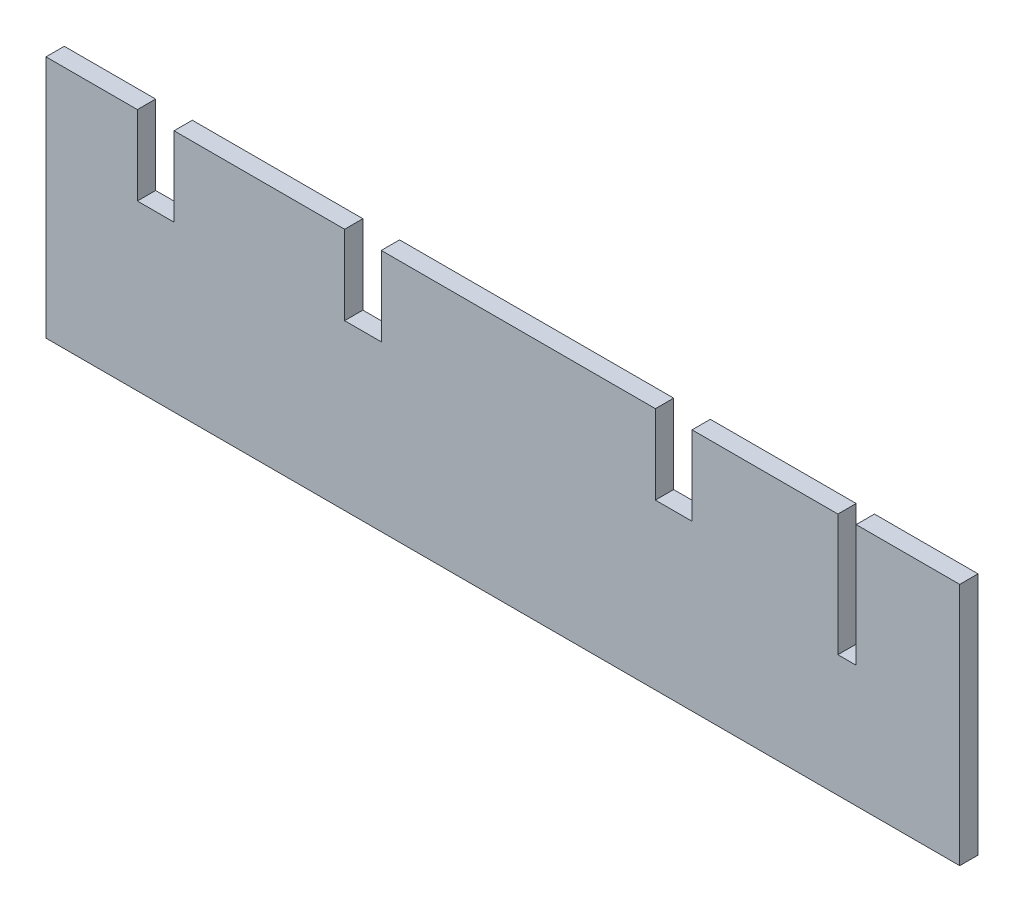
ISO-10303-21;
HEADER;
FILE_DESCRIPTION(('STEP AP214'),'2;1');
FILE_NAME('part.step','',(''),(''),'','','');
FILE_SCHEMA(('AUTOMOTIVE_DESIGN { 1 0 10303 214 1 1 1 1 }'));
ENDSEC;
DATA;
#1=APPLICATION_CONTEXT('core data for automotive mechanical design processes');
#2=APPLICATION_PROTOCOL_DEFINITION('international standard','automotive_design',2000,#1);
#3=PRODUCT_CONTEXT('',#1,'mechanical');
#4=PRODUCT('Part','Part','',(#3));
#5=PRODUCT_RELATED_PRODUCT_CATEGORY('part','',(#4));
#6=PRODUCT_DEFINITION_FORMATION('','',#4);
#7=PRODUCT_DEFINITION_CONTEXT('part definition',#1,'design');
#8=PRODUCT_DEFINITION('design','',#6,#7);
#9=PRODUCT_DEFINITION_SHAPE('','',#8);
#10=(LENGTH_UNIT() NAMED_UNIT(*) SI_UNIT(.MILLI.,.METRE.));
#11=(NAMED_UNIT(*) PLANE_ANGLE_UNIT() SI_UNIT($,.RADIAN.));
#12=(NAMED_UNIT(*) SI_UNIT($,.STERADIAN.) SOLID_ANGLE_UNIT());
#13=UNCERTAINTY_MEASURE_WITH_UNIT(LENGTH_MEASURE(1.E-05),#10,'distance_accuracy_value','');
#14=(GEOMETRIC_REPRESENTATION_CONTEXT(3) GLOBAL_UNCERTAINTY_ASSIGNED_CONTEXT((#13)) GLOBAL_UNIT_ASSIGNED_CONTEXT((#10,
#11,#12)) REPRESENTATION_CONTEXT('',''));
#15=CARTESIAN_POINT('',(0.,0.,0.));
#16=DIRECTION('',(0.,0.,1.));
#17=DIRECTION('',(1.,0.,0.));
#18=AXIS2_PLACEMENT_3D('',#15,#16,#17);
#19=CARTESIAN_POINT('',(-167.88,40.,6.));
#20=DIRECTION('',(0.,-1.,0.));
#21=DIRECTION('',(0.,0.,-1.));
#22=AXIS2_PLACEMENT_3D('',#19,#20,#21);
#23=PLANE('',#22);
#24=DIRECTION('',(-1.,0.,0.));
#25=VECTOR('',#24,1.);
#26=CARTESIAN_POINT('',(-167.88,40.,0.));
#27=LINE('',#26,#25);
#28=CARTESIAN_POINT('',(-80.,40.,0.));
#29=VERTEX_POINT('',#28);
#30=CARTESIAN_POINT('',(-114.,40.,0.));
#31=VERTEX_POINT('',#30);
#32=EDGE_CURVE('E203',#29,#31,#27,.T.);
#33=ORIENTED_EDGE('',*,*,#32,.T.);
#34=DIRECTION('',(0.,0.,-1.));
#35=VECTOR('',#34,1.);
#36=CARTESIAN_POINT('',(-114.,40.,10.));
#37=LINE('',#36,#35);
#38=CARTESIAN_POINT('',(-114.,40.,6.));
#39=VERTEX_POINT('',#38);
#40=EDGE_CURVE('E277',#39,#31,#37,.T.);
#41=ORIENTED_EDGE('',*,*,#40,.F.);
#42=DIRECTION('',(-1.,0.,0.));
#43=VECTOR('',#42,1.);
#44=CARTESIAN_POINT('',(-167.88,40.,6.));
#45=LINE('',#44,#43);
#46=CARTESIAN_POINT('',(-80.,40.,6.));
#47=VERTEX_POINT('',#46);
#48=EDGE_CURVE('E311',#47,#39,#45,.T.);
#49=ORIENTED_EDGE('',*,*,#48,.F.);
#50=DIRECTION('',(0.,0.,-1.));
#51=VECTOR('',#50,1.);
#52=CARTESIAN_POINT('',(-80.,40.,6.));
#53=LINE('',#52,#51);
#54=EDGE_CURVE('E259',#47,#29,#53,.T.);
#55=ORIENTED_EDGE('',*,*,#54,.T.);
#56=EDGE_LOOP('',(#33,#41,#49,#55));
#57=FACE_BOUND('',#56,.T.);
#58=ADVANCED_FACE('F37',(#57),#23,.F.);
#59=CARTESIAN_POINT('',(-380.,40.,6.));
#60=DIRECTION('',(1.,0.,0.));
#61=DIRECTION('',(0.,0.,-1.));
#62=AXIS2_PLACEMENT_3D('',#59,#60,#61);
#63=PLANE('',#62);
#64=DIRECTION('',(0.,-1.,0.));
#65=VECTOR('',#64,1.);
#66=CARTESIAN_POINT('',(-380.,40.,0.));
#67=LINE('',#66,#65);
#68=CARTESIAN_POINT('',(-380.,40.,0.));
#69=VERTEX_POINT('',#68);
#70=CARTESIAN_POINT('',(-380.,-40.,0.));
#71=VERTEX_POINT('',#70);
#72=EDGE_CURVE('E194',#69,#71,#67,.T.);
#73=ORIENTED_EDGE('',*,*,#72,.T.);
#74=DIRECTION('',(0.,0.,-1.));
#75=VECTOR('',#74,1.);
#76=CARTESIAN_POINT('',(-380.,-40.,6.));
#77=LINE('',#76,#75);
#78=CARTESIAN_POINT('',(-380.,-40.,6.));
#79=VERTEX_POINT('',#78);
#80=EDGE_CURVE('E11',#79,#71,#77,.T.);
#81=ORIENTED_EDGE('',*,*,#80,.F.);
#82=DIRECTION('',(0.,-1.,0.));
#83=VECTOR('',#82,1.);
#84=CARTESIAN_POINT('',(-380.,40.,6.));
#85=LINE('',#84,#83);
#86=CARTESIAN_POINT('',(-380.,40.,6.));
#87=VERTEX_POINT('',#86);
#88=EDGE_CURVE('E228',#87,#79,#85,.T.);
#89=ORIENTED_EDGE('',*,*,#88,.F.);
#90=DIRECTION('',(0.,0.,-1.));
#91=VECTOR('',#90,1.);
#92=CARTESIAN_POINT('',(-380.,40.,6.));
#93=LINE('',#92,#91);
#94=EDGE_CURVE('E190',#87,#69,#93,.T.);
#95=ORIENTED_EDGE('',*,*,#94,.T.);
#96=EDGE_LOOP('',(#73,#81,#89,#95));
#97=FACE_BOUND('',#96,.T.);
#98=ADVANCED_FACE('F39',(#97),#63,.F.);
#99=CARTESIAN_POINT('',(-380.,-40.,6.));
#100=DIRECTION('',(0.,1.,0.));
#101=DIRECTION('',(-1.,0.,0.));
#102=AXIS2_PLACEMENT_3D('',#99,#100,#101);
#103=PLANE('',#102);
#104=DIRECTION('',(1.,0.,0.));
#105=VECTOR('',#104,1.);
#106=CARTESIAN_POINT('',(-380.,-40.,0.));
#107=LINE('',#106,#105);
#108=CARTESIAN_POINT('',(-80.,-40.,0.));
#109=VERTEX_POINT('',#108);
#110=EDGE_CURVE('E197',#71,#109,#107,.T.);
#111=ORIENTED_EDGE('',*,*,#110,.T.);
#112=DIRECTION('',(0.,0.,-1.));
#113=VECTOR('',#112,1.);
#114=CARTESIAN_POINT('',(-80.,-40.,6.));
#115=LINE('',#114,#113);
#116=CARTESIAN_POINT('',(-80.,-40.,6.));
#117=VERTEX_POINT('',#116);
#118=EDGE_CURVE('E45',#117,#109,#115,.T.);
#119=ORIENTED_EDGE('',*,*,#118,.F.);
#120=DIRECTION('',(1.,0.,0.));
#121=VECTOR('',#120,1.);
#122=CARTESIAN_POINT('',(-380.,-40.,6.));
#123=LINE('',#122,#121);
#124=EDGE_CURVE('E126',#79,#117,#123,.T.);
#125=ORIENTED_EDGE('',*,*,#124,.F.);
#126=ORIENTED_EDGE('',*,*,#80,.T.);
#127=EDGE_LOOP('',(#111,#119,#125,#126));
#128=FACE_BOUND('',#127,.T.);
#129=ADVANCED_FACE('F342',(#128),#103,.F.);
#130=CARTESIAN_POINT('',(-80.,40.,6.));
#131=DIRECTION('',(-1.,0.,0.));
#132=DIRECTION('',(0.,0.,1.));
#133=AXIS2_PLACEMENT_3D('',#130,#131,#132);
#134=PLANE('',#133);
#135=DIRECTION('',(0.,1.,0.));
#136=VECTOR('',#135,1.);
#137=CARTESIAN_POINT('',(-80.,40.,0.));
#138=LINE('',#137,#136);
#139=EDGE_CURVE('E200',#109,#29,#138,.T.);
#140=ORIENTED_EDGE('',*,*,#139,.T.);
#141=ORIENTED_EDGE('',*,*,#54,.F.);
#142=DIRECTION('',(0.,1.,0.));
#143=VECTOR('',#142,1.);
#144=CARTESIAN_POINT('',(-80.,40.,6.));
#145=LINE('',#144,#143);
#146=EDGE_CURVE('E267',#117,#47,#145,.T.);
#147=ORIENTED_EDGE('',*,*,#146,.F.);
#148=ORIENTED_EDGE('',*,*,#118,.T.);
#149=EDGE_LOOP('',(#140,#141,#147,#148));
#150=FACE_BOUND('',#149,.T.);
#151=ADVANCED_FACE('F265',(#150),#134,.F.);
#152=CARTESIAN_POINT('',(-120.,40.,6.));
#153=VERTEX_POINT('',#152);
#154=CARTESIAN_POINT('',(-167.88,40.,6.));
#155=VERTEX_POINT('',#154);
#156=EDGE_CURVE('E310',#153,#155,#45,.T.);
#157=ORIENTED_EDGE('',*,*,#156,.F.);
#158=DIRECTION('',(0.,0.,-1.));
#159=VECTOR('',#158,1.);
#160=CARTESIAN_POINT('',(-120.,40.,10.));
#161=LINE('',#160,#159);
#162=CARTESIAN_POINT('',(-120.,40.,0.));
#163=VERTEX_POINT('',#162);
#164=EDGE_CURVE('E296',#153,#163,#161,.T.);
#165=ORIENTED_EDGE('',*,*,#164,.T.);
#166=CARTESIAN_POINT('',(-167.88,40.,0.));
#167=VERTEX_POINT('',#166);
#168=EDGE_CURVE('E202',#163,#167,#27,.T.);
#169=ORIENTED_EDGE('',*,*,#168,.T.);
#170=DIRECTION('',(0.,0.,-1.));
#171=VECTOR('',#170,1.);
#172=CARTESIAN_POINT('',(-167.88,40.,6.));
#173=LINE('',#172,#171);
#174=EDGE_CURVE('E256',#155,#167,#173,.T.);
#175=ORIENTED_EDGE('',*,*,#174,.F.);
#176=EDGE_LOOP('',(#157,#165,#169,#175));
#177=FACE_BOUND('',#176,.T.);
#178=ADVANCED_FACE('F348',(#177),#23,.F.);
#179=CARTESIAN_POINT('',(-167.88,14.,6.));
#180=DIRECTION('',(1.,0.,0.));
#181=DIRECTION('',(0.,0.,-1.));
#182=AXIS2_PLACEMENT_3D('',#179,#180,#181);
#183=PLANE('',#182);
#184=DIRECTION('',(0.,-1.,0.));
#185=VECTOR('',#184,1.);
#186=CARTESIAN_POINT('',(-167.88,14.,0.));
#187=LINE('',#186,#185);
#188=CARTESIAN_POINT('',(-167.88,14.,0.));
#189=VERTEX_POINT('',#188);
#190=EDGE_CURVE('E206',#167,#189,#187,.T.);
#191=ORIENTED_EDGE('',*,*,#190,.T.);
#192=DIRECTION('',(0.,0.,-1.));
#193=VECTOR('',#192,1.);
#194=CARTESIAN_POINT('',(-167.88,14.,6.));
#195=LINE('',#194,#193);
#196=CARTESIAN_POINT('',(-167.88,14.,6.));
#197=VERTEX_POINT('',#196);
#198=EDGE_CURVE('E253',#197,#189,#195,.T.);
#199=ORIENTED_EDGE('',*,*,#198,.F.);
#200=DIRECTION('',(0.,-1.,0.));
#201=VECTOR('',#200,1.);
#202=CARTESIAN_POINT('',(-167.88,14.,6.));
#203=LINE('',#202,#201);
#204=EDGE_CURVE('E313',#155,#197,#203,.T.);
#205=ORIENTED_EDGE('',*,*,#204,.F.);
#206=ORIENTED_EDGE('',*,*,#174,.T.);
#207=EDGE_LOOP('',(#191,#199,#205,#206));
#208=FACE_BOUND('',#207,.T.);
#209=ADVANCED_FACE('F356',(#208),#183,.F.);
#210=CARTESIAN_POINT('',(-179.92,14.,6.));
#211=DIRECTION('',(0.,-1.,0.));
#212=DIRECTION('',(0.,0.,-1.));
#213=AXIS2_PLACEMENT_3D('',#210,#211,#212);
#214=PLANE('',#213);
#215=DIRECTION('',(-1.,0.,0.));
#216=VECTOR('',#215,1.);
#217=CARTESIAN_POINT('',(-179.92,14.,0.));
#218=LINE('',#217,#216);
#219=CARTESIAN_POINT('',(-179.92,14.,0.));
#220=VERTEX_POINT('',#219);
#221=EDGE_CURVE('E208',#189,#220,#218,.T.);
#222=ORIENTED_EDGE('',*,*,#221,.T.);
#223=DIRECTION('',(0.,0.,-1.));
#224=VECTOR('',#223,1.);
#225=CARTESIAN_POINT('',(-179.92,14.,6.));
#226=LINE('',#225,#224);
#227=CARTESIAN_POINT('',(-179.92,14.,6.));
#228=VERTEX_POINT('',#227);
#229=EDGE_CURVE('E250',#228,#220,#226,.T.);
#230=ORIENTED_EDGE('',*,*,#229,.F.);
#231=DIRECTION('',(-1.,0.,0.));
#232=VECTOR('',#231,1.);
#233=CARTESIAN_POINT('',(-179.92,14.,6.));
#234=LINE('',#233,#232);
#235=EDGE_CURVE('E315',#197,#228,#234,.T.);
#236=ORIENTED_EDGE('',*,*,#235,.F.);
#237=ORIENTED_EDGE('',*,*,#198,.T.);
#238=EDGE_LOOP('',(#222,#230,#236,#237));
#239=FACE_BOUND('',#238,.T.);
#240=ADVANCED_FACE('F361',(#239),#214,.F.);
#241=CARTESIAN_POINT('',(-179.92,14.,6.));
#242=DIRECTION('',(-1.,0.,0.));
#243=DIRECTION('',(0.,0.,1.));
#244=AXIS2_PLACEMENT_3D('',#241,#242,#243);
#245=PLANE('',#244);
#246=DIRECTION('',(0.,1.,0.));
#247=VECTOR('',#246,1.);
#248=CARTESIAN_POINT('',(-179.92,14.,0.));
#249=LINE('',#248,#247);
#250=CARTESIAN_POINT('',(-179.92,40.,0.));
#251=VERTEX_POINT('',#250);
#252=EDGE_CURVE('E210',#220,#251,#249,.T.);
#253=ORIENTED_EDGE('',*,*,#252,.T.);
#254=DIRECTION('',(0.,0.,-1.));
#255=VECTOR('',#254,1.);
#256=CARTESIAN_POINT('',(-179.92,40.,6.));
#257=LINE('',#256,#255);
#258=CARTESIAN_POINT('',(-179.92,40.,6.));
#259=VERTEX_POINT('',#258);
#260=EDGE_CURVE('E247',#259,#251,#257,.T.);
#261=ORIENTED_EDGE('',*,*,#260,.F.);
#262=DIRECTION('',(0.,1.,0.));
#263=VECTOR('',#262,1.);
#264=CARTESIAN_POINT('',(-179.92,14.,6.));
#265=LINE('',#264,#263);
#266=EDGE_CURVE('E317',#228,#259,#265,.T.);
#267=ORIENTED_EDGE('',*,*,#266,.F.);
#268=ORIENTED_EDGE('',*,*,#229,.T.);
#269=EDGE_LOOP('',(#253,#261,#267,#268));
#270=FACE_BOUND('',#269,.T.);
#271=ADVANCED_FACE('F395',(#270),#245,.F.);
#272=CARTESIAN_POINT('',(-269.92,40.,6.));
#273=DIRECTION('',(0.,-1.,0.));
#274=DIRECTION('',(0.,0.,-1.));
#275=AXIS2_PLACEMENT_3D('',#272,#273,#274);
#276=PLANE('',#275);
#277=DIRECTION('',(-1.,0.,0.));
#278=VECTOR('',#277,1.);
#279=CARTESIAN_POINT('',(-269.92,40.,0.));
#280=LINE('',#279,#278);
#281=CARTESIAN_POINT('',(-269.92,40.,0.));
#282=VERTEX_POINT('',#281);
#283=EDGE_CURVE('E212',#251,#282,#280,.T.);
#284=ORIENTED_EDGE('',*,*,#283,.T.);
#285=DIRECTION('',(0.,0.,-1.));
#286=VECTOR('',#285,1.);
#287=CARTESIAN_POINT('',(-269.92,40.,6.));
#288=LINE('',#287,#286);
#289=CARTESIAN_POINT('',(-269.92,40.,6.));
#290=VERTEX_POINT('',#289);
#291=EDGE_CURVE('E244',#290,#282,#288,.T.);
#292=ORIENTED_EDGE('',*,*,#291,.F.);
#293=DIRECTION('',(-1.,0.,0.));
#294=VECTOR('',#293,1.);
#295=CARTESIAN_POINT('',(-269.92,40.,6.));
#296=LINE('',#295,#294);
#297=EDGE_CURVE('E319',#259,#290,#296,.T.);
#298=ORIENTED_EDGE('',*,*,#297,.F.);
#299=ORIENTED_EDGE('',*,*,#260,.T.);
#300=EDGE_LOOP('',(#284,#292,#298,#299));
#301=FACE_BOUND('',#300,.T.);
#302=ADVANCED_FACE('F399',(#301),#276,.F.);
#303=CARTESIAN_POINT('',(-269.92,14.,6.));
#304=DIRECTION('',(1.,0.,0.));
#305=DIRECTION('',(0.,0.,-1.));
#306=AXIS2_PLACEMENT_3D('',#303,#304,#305);
#307=PLANE('',#306);
#308=DIRECTION('',(0.,-1.,0.));
#309=VECTOR('',#308,1.);
#310=CARTESIAN_POINT('',(-269.92,14.,0.));
#311=LINE('',#310,#309);
#312=CARTESIAN_POINT('',(-269.92,14.,0.));
#313=VERTEX_POINT('',#312);
#314=EDGE_CURVE('E214',#282,#313,#311,.T.);
#315=ORIENTED_EDGE('',*,*,#314,.T.);
#316=DIRECTION('',(0.,0.,-1.));
#317=VECTOR('',#316,1.);
#318=CARTESIAN_POINT('',(-269.92,14.,6.));
#319=LINE('',#318,#317);
#320=CARTESIAN_POINT('',(-269.92,14.,6.));
#321=VERTEX_POINT('',#320);
#322=EDGE_CURVE('E241',#321,#313,#319,.T.);
#323=ORIENTED_EDGE('',*,*,#322,.F.);
#324=DIRECTION('',(0.,-1.,0.));
#325=VECTOR('',#324,1.);
#326=CARTESIAN_POINT('',(-269.92,14.,6.));
#327=LINE('',#326,#325);
#328=EDGE_CURVE('E321',#290,#321,#327,.T.);
#329=ORIENTED_EDGE('',*,*,#328,.F.);
#330=ORIENTED_EDGE('',*,*,#291,.T.);
#331=EDGE_LOOP('',(#315,#323,#329,#330));
#332=FACE_BOUND('',#331,.T.);
#333=ADVANCED_FACE('F404',(#332),#307,.F.);
#334=CARTESIAN_POINT('',(-281.96,14.,6.));
#335=DIRECTION('',(0.,-1.,0.));
#336=DIRECTION('',(0.,0.,-1.));
#337=AXIS2_PLACEMENT_3D('',#334,#335,#336);
#338=PLANE('',#337);
#339=DIRECTION('',(-1.,0.,0.));
#340=VECTOR('',#339,1.);
#341=CARTESIAN_POINT('',(-281.96,14.,0.));
#342=LINE('',#341,#340);
#343=CARTESIAN_POINT('',(-281.96,14.,0.));
#344=VERTEX_POINT('',#343);
#345=EDGE_CURVE('E216',#313,#344,#342,.T.);
#346=ORIENTED_EDGE('',*,*,#345,.T.);
#347=DIRECTION('',(0.,0.,-1.));
#348=VECTOR('',#347,1.);
#349=CARTESIAN_POINT('',(-281.96,14.,6.));
#350=LINE('',#349,#348);
#351=CARTESIAN_POINT('',(-281.96,14.,6.));
#352=VERTEX_POINT('',#351);
#353=EDGE_CURVE('E238',#352,#344,#350,.T.);
#354=ORIENTED_EDGE('',*,*,#353,.F.);
#355=DIRECTION('',(-1.,0.,0.));
#356=VECTOR('',#355,1.);
#357=CARTESIAN_POINT('',(-281.96,14.,6.));
#358=LINE('',#357,#356);
#359=EDGE_CURVE('E323',#321,#352,#358,.T.);
#360=ORIENTED_EDGE('',*,*,#359,.F.);
#361=ORIENTED_EDGE('',*,*,#322,.T.);
#362=EDGE_LOOP('',(#346,#354,#360,#361));
#363=FACE_BOUND('',#362,.T.);
#364=ADVANCED_FACE('F408',(#363),#338,.F.);
#365=CARTESIAN_POINT('',(-281.96,14.,6.));
#366=DIRECTION('',(-1.,0.,0.));
#367=DIRECTION('',(0.,0.,1.));
#368=AXIS2_PLACEMENT_3D('',#365,#366,#367);
#369=PLANE('',#368);
#370=DIRECTION('',(0.,1.,0.));
#371=VECTOR('',#370,1.);
#372=CARTESIAN_POINT('',(-281.96,14.,0.));
#373=LINE('',#372,#371);
#374=CARTESIAN_POINT('',(-281.96,40.,0.));
#375=VERTEX_POINT('',#374);
#376=EDGE_CURVE('E218',#344,#375,#373,.T.);
#377=ORIENTED_EDGE('',*,*,#376,.T.);
#378=DIRECTION('',(0.,0.,-1.));
#379=VECTOR('',#378,1.);
#380=CARTESIAN_POINT('',(-281.96,40.,6.));
#381=LINE('',#380,#379);
#382=CARTESIAN_POINT('',(-281.96,40.,6.));
#383=VERTEX_POINT('',#382);
#384=EDGE_CURVE('E235',#383,#375,#381,.T.);
#385=ORIENTED_EDGE('',*,*,#384,.F.);
#386=DIRECTION('',(0.,1.,0.));
#387=VECTOR('',#386,1.);
#388=CARTESIAN_POINT('',(-281.96,14.,6.));
#389=LINE('',#388,#387);
#390=EDGE_CURVE('E325',#352,#383,#389,.T.);
#391=ORIENTED_EDGE('',*,*,#390,.F.);
#392=ORIENTED_EDGE('',*,*,#353,.T.);
#393=EDGE_LOOP('',(#377,#385,#391,#392));
#394=FACE_BOUND('',#393,.T.);
#395=ADVANCED_FACE('F412',(#394),#369,.F.);
#396=CARTESIAN_POINT('',(-337.96,40.,6.));
#397=DIRECTION('',(0.,-1.,0.));
#398=DIRECTION('',(0.,0.,-1.));
#399=AXIS2_PLACEMENT_3D('',#396,#397,#398);
#400=PLANE('',#399);
#401=DIRECTION('',(-1.,0.,0.));
#402=VECTOR('',#401,1.);
#403=CARTESIAN_POINT('',(-337.96,40.,0.));
#404=LINE('',#403,#402);
#405=CARTESIAN_POINT('',(-337.96,40.,0.));
#406=VERTEX_POINT('',#405);
#407=EDGE_CURVE('E220',#375,#406,#404,.T.);
#408=ORIENTED_EDGE('',*,*,#407,.T.);
#409=DIRECTION('',(0.,0.,-1.));
#410=VECTOR('',#409,1.);
#411=CARTESIAN_POINT('',(-337.96,40.,6.));
#412=LINE('',#411,#410);
#413=CARTESIAN_POINT('',(-337.96,40.,6.));
#414=VERTEX_POINT('',#413);
#415=EDGE_CURVE('E232',#414,#406,#412,.T.);
#416=ORIENTED_EDGE('',*,*,#415,.F.);
#417=DIRECTION('',(-1.,0.,0.));
#418=VECTOR('',#417,1.);
#419=CARTESIAN_POINT('',(-337.96,40.,6.));
#420=LINE('',#419,#418);
#421=EDGE_CURVE('E327',#383,#414,#420,.T.);
#422=ORIENTED_EDGE('',*,*,#421,.F.);
#423=ORIENTED_EDGE('',*,*,#384,.T.);
#424=EDGE_LOOP('',(#408,#416,#422,#423));
#425=FACE_BOUND('',#424,.T.);
#426=ADVANCED_FACE('F333',(#425),#400,.F.);
#427=CARTESIAN_POINT('',(-337.96,14.,6.));
#428=DIRECTION('',(1.,0.,0.));
#429=DIRECTION('',(0.,0.,-1.));
#430=AXIS2_PLACEMENT_3D('',#427,#428,#429);
#431=PLANE('',#430);
#432=DIRECTION('',(0.,-1.,0.));
#433=VECTOR('',#432,1.);
#434=CARTESIAN_POINT('',(-337.96,14.,0.));
#435=LINE('',#434,#433);
#436=CARTESIAN_POINT('',(-337.96,14.,0.));
#437=VERTEX_POINT('',#436);
#438=EDGE_CURVE('E222',#406,#437,#435,.T.);
#439=ORIENTED_EDGE('',*,*,#438,.T.);
#440=DIRECTION('',(0.,0.,-1.));
#441=VECTOR('',#440,1.);
#442=CARTESIAN_POINT('',(-337.96,14.,6.));
#443=LINE('',#442,#441);
#444=CARTESIAN_POINT('',(-337.96,14.,6.));
#445=VERTEX_POINT('',#444);
#446=EDGE_CURVE('E185',#445,#437,#443,.T.);
#447=ORIENTED_EDGE('',*,*,#446,.F.);
#448=DIRECTION('',(0.,-1.,0.));
#449=VECTOR('',#448,1.);
#450=CARTESIAN_POINT('',(-337.96,14.,6.));
#451=LINE('',#450,#449);
#452=EDGE_CURVE('E173',#414,#445,#451,.T.);
#453=ORIENTED_EDGE('',*,*,#452,.F.);
#454=ORIENTED_EDGE('',*,*,#415,.T.);
#455=EDGE_LOOP('',(#439,#447,#453,#454));
#456=FACE_BOUND('',#455,.T.);
#457=ADVANCED_FACE('F337',(#456),#431,.F.);
#458=CARTESIAN_POINT('',(-350.,14.,6.));
#459=DIRECTION('',(0.,-1.,0.));
#460=DIRECTION('',(0.,0.,-1.));
#461=AXIS2_PLACEMENT_3D('',#458,#459,#460);
#462=PLANE('',#461);
#463=DIRECTION('',(-1.,0.,0.));
#464=VECTOR('',#463,1.);
#465=CARTESIAN_POINT('',(-350.,14.,0.));
#466=LINE('',#465,#464);
#467=CARTESIAN_POINT('',(-350.,14.,0.));
#468=VERTEX_POINT('',#467);
#469=EDGE_CURVE('E182',#437,#468,#466,.T.);
#470=ORIENTED_EDGE('',*,*,#469,.T.);
#471=DIRECTION('',(0.,0.,-1.));
#472=VECTOR('',#471,1.);
#473=CARTESIAN_POINT('',(-350.,14.,6.));
#474=LINE('',#473,#472);
#475=CARTESIAN_POINT('',(-350.,14.,6.));
#476=VERTEX_POINT('',#475);
#477=EDGE_CURVE('E179',#476,#468,#474,.T.);
#478=ORIENTED_EDGE('',*,*,#477,.F.);
#479=DIRECTION('',(-1.,0.,0.));
#480=VECTOR('',#479,1.);
#481=CARTESIAN_POINT('',(-350.,14.,6.));
#482=LINE('',#481,#480);
#483=EDGE_CURVE('E165',#445,#476,#482,.T.);
#484=ORIENTED_EDGE('',*,*,#483,.F.);
#485=ORIENTED_EDGE('',*,*,#446,.T.);
#486=EDGE_LOOP('',(#470,#478,#484,#485));
#487=FACE_BOUND('',#486,.T.);
#488=ADVANCED_FACE('F180',(#487),#462,.F.);
#489=CARTESIAN_POINT('',(-350.,40.,6.));
#490=DIRECTION('',(-1.,0.,0.));
#491=DIRECTION('',(0.,0.,1.));
#492=AXIS2_PLACEMENT_3D('',#489,#490,#491);
#493=PLANE('',#492);
#494=DIRECTION('',(0.,1.,0.));
#495=VECTOR('',#494,1.);
#496=CARTESIAN_POINT('',(-350.,40.,0.));
#497=LINE('',#496,#495);
#498=CARTESIAN_POINT('',(-350.,40.,0.));
#499=VERTEX_POINT('',#498);
#500=EDGE_CURVE('E225',#468,#499,#497,.T.);
#501=ORIENTED_EDGE('',*,*,#500,.T.);
#502=DIRECTION('',(0.,0.,-1.));
#503=VECTOR('',#502,1.);
#504=CARTESIAN_POINT('',(-350.,40.,6.));
#505=LINE('',#504,#503);
#506=CARTESIAN_POINT('',(-350.,40.,6.));
#507=VERTEX_POINT('',#506);
#508=EDGE_CURVE('E186',#507,#499,#505,.T.);
#509=ORIENTED_EDGE('',*,*,#508,.F.);
#510=DIRECTION('',(0.,1.,0.));
#511=VECTOR('',#510,1.);
#512=CARTESIAN_POINT('',(-350.,40.,6.));
#513=LINE('',#512,#511);
#514=EDGE_CURVE('E170',#476,#507,#513,.T.);
#515=ORIENTED_EDGE('',*,*,#514,.F.);
#516=ORIENTED_EDGE('',*,*,#477,.T.);
#517=EDGE_LOOP('',(#501,#509,#515,#516));
#518=FACE_BOUND('',#517,.T.);
#519=ADVANCED_FACE('F188',(#518),#493,.F.);
#520=CARTESIAN_POINT('',(-380.,40.,6.));
#521=DIRECTION('',(0.,-1.,0.));
#522=DIRECTION('',(0.,0.,-1.));
#523=AXIS2_PLACEMENT_3D('',#520,#521,#522);
#524=PLANE('',#523);
#525=DIRECTION('',(-1.,0.,0.));
#526=VECTOR('',#525,1.);
#527=CARTESIAN_POINT('',(-380.,40.,0.));
#528=LINE('',#527,#526);
#529=EDGE_CURVE('E118',#499,#69,#528,.T.);
#530=ORIENTED_EDGE('',*,*,#529,.T.);
#531=ORIENTED_EDGE('',*,*,#94,.F.);
#532=DIRECTION('',(-1.,0.,0.));
#533=VECTOR('',#532,1.);
#534=CARTESIAN_POINT('',(-380.,40.,6.));
#535=LINE('',#534,#533);
#536=EDGE_CURVE('E61',#507,#87,#535,.T.);
#537=ORIENTED_EDGE('',*,*,#536,.F.);
#538=ORIENTED_EDGE('',*,*,#508,.T.);
#539=EDGE_LOOP('',(#530,#531,#537,#538));
#540=FACE_BOUND('',#539,.T.);
#541=ADVANCED_FACE('F338',(#540),#524,.F.);
#542=CARTESIAN_POINT('',(0.,0.,6.));
#543=DIRECTION('',(0.,0.,1.));
#544=DIRECTION('',(1.,0.,0.));
#545=AXIS2_PLACEMENT_3D('',#542,#543,#544);
#546=PLANE('',#545);
#547=DIRECTION('',(0.,1.,0.));
#548=VECTOR('',#547,1.);
#549=CARTESIAN_POINT('',(-114.,0.,6.));
#550=LINE('',#549,#548);
#551=CARTESIAN_POINT('',(-114.,0.,6.));
#552=VERTEX_POINT('',#551);
#553=EDGE_CURVE('E198',#552,#39,#550,.T.);
#554=ORIENTED_EDGE('',*,*,#553,.F.);
#555=DIRECTION('',(1.,0.,0.));
#556=VECTOR('',#555,1.);
#557=CARTESIAN_POINT('',(0.,0.,6.));
#558=LINE('',#557,#556);
#559=CARTESIAN_POINT('',(-120.,0.,6.));
#560=VERTEX_POINT('',#559);
#561=EDGE_CURVE('E303',#560,#552,#558,.T.);
#562=ORIENTED_EDGE('',*,*,#561,.F.);
#563=DIRECTION('',(0.,-1.,0.));
#564=VECTOR('',#563,1.);
#565=CARTESIAN_POINT('',(-120.,0.,6.));
#566=LINE('',#565,#564);
#567=EDGE_CURVE('E301',#153,#560,#566,.T.);
#568=ORIENTED_EDGE('',*,*,#567,.F.);
#569=ORIENTED_EDGE('',*,*,#156,.T.);
#570=ORIENTED_EDGE('',*,*,#204,.T.);
#571=ORIENTED_EDGE('',*,*,#235,.T.);
#572=ORIENTED_EDGE('',*,*,#266,.T.);
#573=ORIENTED_EDGE('',*,*,#297,.T.);
#574=ORIENTED_EDGE('',*,*,#328,.T.);
#575=ORIENTED_EDGE('',*,*,#359,.T.);
#576=ORIENTED_EDGE('',*,*,#390,.T.);
#577=ORIENTED_EDGE('',*,*,#421,.T.);
#578=ORIENTED_EDGE('',*,*,#452,.T.);
#579=ORIENTED_EDGE('',*,*,#483,.T.);
#580=ORIENTED_EDGE('',*,*,#514,.T.);
#581=ORIENTED_EDGE('',*,*,#536,.T.);
#582=ORIENTED_EDGE('',*,*,#88,.T.);
#583=ORIENTED_EDGE('',*,*,#124,.T.);
#584=ORIENTED_EDGE('',*,*,#146,.T.);
#585=ORIENTED_EDGE('',*,*,#48,.T.);
#586=EDGE_LOOP('',(#554,#562,#568,#569,#570,#571,#572,#573,#574,#575,#576,#577,#578,#579,#580,
#581,#582,#583,#584,#585));
#587=FACE_BOUND('',#586,.T.);
#588=ADVANCED_FACE('F168',(#587),#546,.T.);
#589=CARTESIAN_POINT('',(0.,0.,0.));
#590=DIRECTION('',(0.,0.,1.));
#591=DIRECTION('',(1.,0.,0.));
#592=AXIS2_PLACEMENT_3D('',#589,#590,#591);
#593=PLANE('',#592);
#594=DIRECTION('',(-1.,0.,0.));
#595=VECTOR('',#594,1.);
#596=CARTESIAN_POINT('',(-114.,0.,0.));
#597=LINE('',#596,#595);
#598=CARTESIAN_POINT('',(-114.,0.,0.));
#599=VERTEX_POINT('',#598);
#600=CARTESIAN_POINT('',(-120.,0.,0.));
#601=VERTEX_POINT('',#600);
#602=EDGE_CURVE('E375',#599,#601,#597,.T.);
#603=ORIENTED_EDGE('',*,*,#602,.F.);
#604=DIRECTION('',(0.,-1.,0.));
#605=VECTOR('',#604,1.);
#606=CARTESIAN_POINT('',(-114.,40.,0.));
#607=LINE('',#606,#605);
#608=EDGE_CURVE('E52',#31,#599,#607,.T.);
#609=ORIENTED_EDGE('',*,*,#608,.F.);
#610=ORIENTED_EDGE('',*,*,#32,.F.);
#611=ORIENTED_EDGE('',*,*,#139,.F.);
#612=ORIENTED_EDGE('',*,*,#110,.F.);
#613=ORIENTED_EDGE('',*,*,#72,.F.);
#614=ORIENTED_EDGE('',*,*,#529,.F.);
#615=ORIENTED_EDGE('',*,*,#500,.F.);
#616=ORIENTED_EDGE('',*,*,#469,.F.);
#617=ORIENTED_EDGE('',*,*,#438,.F.);
#618=ORIENTED_EDGE('',*,*,#407,.F.);
#619=ORIENTED_EDGE('',*,*,#376,.F.);
#620=ORIENTED_EDGE('',*,*,#345,.F.);
#621=ORIENTED_EDGE('',*,*,#314,.F.);
#622=ORIENTED_EDGE('',*,*,#283,.F.);
#623=ORIENTED_EDGE('',*,*,#252,.F.);
#624=ORIENTED_EDGE('',*,*,#221,.F.);
#625=ORIENTED_EDGE('',*,*,#190,.F.);
#626=ORIENTED_EDGE('',*,*,#168,.F.);
#627=DIRECTION('',(0.,1.,0.));
#628=VECTOR('',#627,1.);
#629=CARTESIAN_POINT('',(-120.,40.,0.));
#630=LINE('',#629,#628);
#631=EDGE_CURVE('E379',#601,#163,#630,.T.);
#632=ORIENTED_EDGE('',*,*,#631,.F.);
#633=EDGE_LOOP('',(#603,#609,#610,#611,#612,#613,#614,#615,#616,#617,#618,#619,#620,#621,#622,
#623,#624,#625,#626,#632));
#634=FACE_BOUND('',#633,.T.);
#635=ADVANCED_FACE('F271',(#634),#593,.F.);
#636=CARTESIAN_POINT('',(-114.,40.,10.));
#637=DIRECTION('',(1.,0.,0.));
#638=DIRECTION('',(0.,0.,-1.));
#639=AXIS2_PLACEMENT_3D('',#636,#637,#638);
#640=PLANE('',#639);
#641=ORIENTED_EDGE('',*,*,#553,.T.);
#642=ORIENTED_EDGE('',*,*,#40,.T.);
#643=ORIENTED_EDGE('',*,*,#608,.T.);
#644=DIRECTION('',(0.,0.,-1.));
#645=VECTOR('',#644,1.);
#646=CARTESIAN_POINT('',(-114.,0.,10.));
#647=LINE('',#646,#645);
#648=EDGE_CURVE('E299',#552,#599,#647,.T.);
#649=ORIENTED_EDGE('',*,*,#648,.F.);
#650=EDGE_LOOP('',(#641,#642,#643,#649));
#651=FACE_BOUND('',#650,.T.);
#652=ADVANCED_FACE('F298',(#651),#640,.F.);
#653=CARTESIAN_POINT('',(-120.,40.,10.));
#654=DIRECTION('',(-1.,0.,0.));
#655=DIRECTION('',(0.,0.,1.));
#656=AXIS2_PLACEMENT_3D('',#653,#654,#655);
#657=PLANE('',#656);
#658=ORIENTED_EDGE('',*,*,#567,.T.);
#659=DIRECTION('',(0.,0.,-1.));
#660=VECTOR('',#659,1.);
#661=CARTESIAN_POINT('',(-120.,0.,10.));
#662=LINE('',#661,#660);
#663=EDGE_CURVE('E371',#560,#601,#662,.T.);
#664=ORIENTED_EDGE('',*,*,#663,.T.);
#665=ORIENTED_EDGE('',*,*,#631,.T.);
#666=ORIENTED_EDGE('',*,*,#164,.F.);
#667=EDGE_LOOP('',(#658,#664,#665,#666));
#668=FACE_BOUND('',#667,.T.);
#669=ADVANCED_FACE('F370',(#668),#657,.F.);
#670=CARTESIAN_POINT('',(-114.,0.,10.));
#671=DIRECTION('',(0.,-1.,0.));
#672=DIRECTION('',(0.,0.,-1.));
#673=AXIS2_PLACEMENT_3D('',#670,#671,#672);
#674=PLANE('',#673);
#675=ORIENTED_EDGE('',*,*,#561,.T.);
#676=ORIENTED_EDGE('',*,*,#648,.T.);
#677=ORIENTED_EDGE('',*,*,#602,.T.);
#678=ORIENTED_EDGE('',*,*,#663,.F.);
#679=EDGE_LOOP('',(#675,#676,#677,#678));
#680=FACE_BOUND('',#679,.T.);
#681=ADVANCED_FACE('F374',(#680),#674,.F.);
#682=CLOSED_SHELL('',(#58,#98,#129,#151,#178,#209,#240,#271,#302,#333,#364,#395,#426,#457,#488,
#519,#541,#588,#635,#652,#669,#681));
#683=MANIFOLD_SOLID_BREP('B2',#682);
#684=ADVANCED_BREP_SHAPE_REPRESENTATION('',(#18,#683),#14);
#685=SHAPE_DEFINITION_REPRESENTATION(#9,#684);
ENDSEC;
END-ISO-10303-21;
